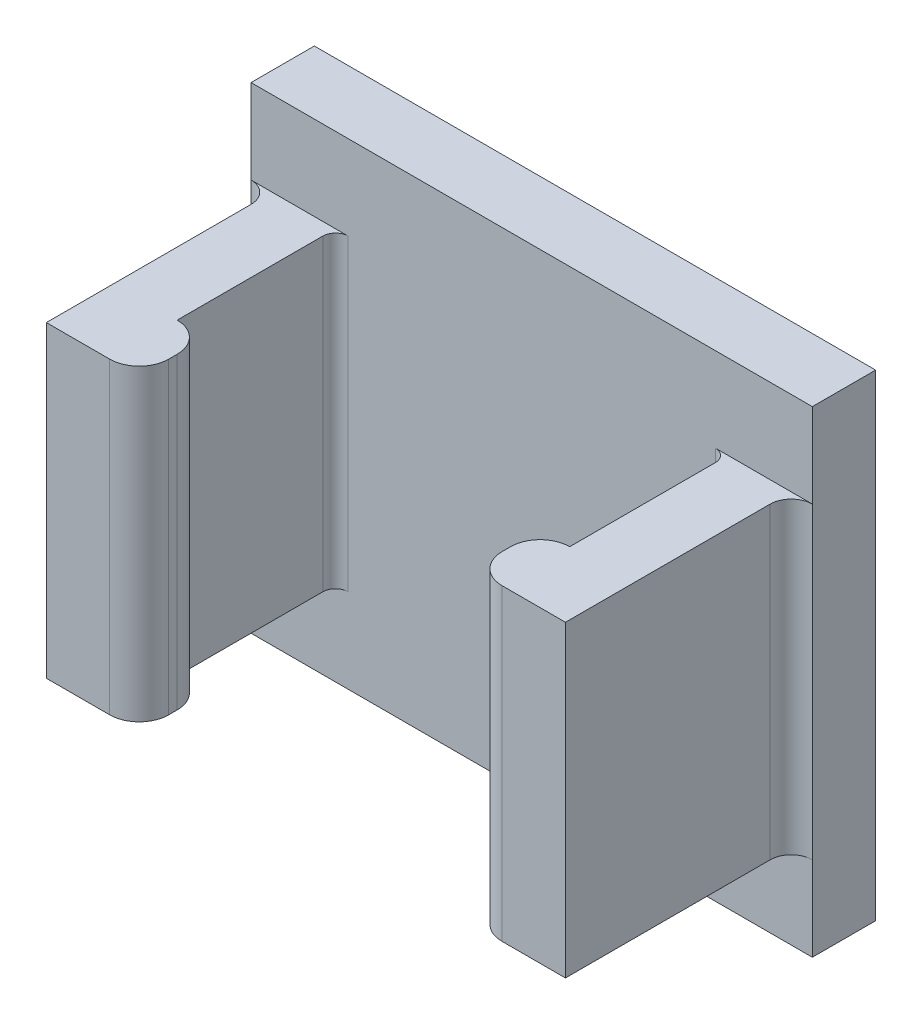
ISO-10303-21;
HEADER;
FILE_DESCRIPTION(('STEP AP214'),'2;1');
FILE_NAME('part.step','',(''),(''),'','','');
FILE_SCHEMA(('AUTOMOTIVE_DESIGN { 1 0 10303 214 1 1 1 1 }'));
ENDSEC;
DATA;
#1=APPLICATION_CONTEXT('core data for automotive mechanical design processes');
#2=APPLICATION_PROTOCOL_DEFINITION('international standard','automotive_design',2000,#1);
#3=PRODUCT_CONTEXT('',#1,'mechanical');
#4=PRODUCT('Part','Part','',(#3));
#5=PRODUCT_RELATED_PRODUCT_CATEGORY('part','',(#4));
#6=PRODUCT_DEFINITION_FORMATION('','',#4);
#7=PRODUCT_DEFINITION_CONTEXT('part definition',#1,'design');
#8=PRODUCT_DEFINITION('design','',#6,#7);
#9=PRODUCT_DEFINITION_SHAPE('','',#8);
#10=(LENGTH_UNIT() NAMED_UNIT(*) SI_UNIT(.MILLI.,.METRE.));
#11=(NAMED_UNIT(*) PLANE_ANGLE_UNIT() SI_UNIT($,.RADIAN.));
#12=(NAMED_UNIT(*) SI_UNIT($,.STERADIAN.) SOLID_ANGLE_UNIT());
#13=UNCERTAINTY_MEASURE_WITH_UNIT(LENGTH_MEASURE(1.E-05),#10,'distance_accuracy_value','');
#14=(GEOMETRIC_REPRESENTATION_CONTEXT(3) GLOBAL_UNCERTAINTY_ASSIGNED_CONTEXT((#13)) GLOBAL_UNIT_ASSIGNED_CONTEXT((#10,
#11,#12)) REPRESENTATION_CONTEXT('',''));
#15=CARTESIAN_POINT('',(0.,0.,0.));
#16=DIRECTION('',(0.,0.,1.));
#17=DIRECTION('',(1.,0.,0.));
#18=AXIS2_PLACEMENT_3D('',#15,#16,#17);
#19=CARTESIAN_POINT('',(-6.15,-5.65,2.5));
#20=DIRECTION('',(1.,0.,0.));
#21=DIRECTION('',(0.,0.,-1.));
#22=AXIS2_PLACEMENT_3D('',#19,#20,#21);
#23=PLANE('',#22);
#24=DIRECTION('',(0.,0.,1.));
#25=VECTOR('',#24,1.);
#26=CARTESIAN_POINT('',(-6.15,3.65,6.85));
#27=LINE('',#26,#25);
#28=CARTESIAN_POINT('',(-6.15,3.65,2.));
#29=VERTEX_POINT('',#28);
#30=CARTESIAN_POINT('',(-6.15,3.65,6.85));
#31=VERTEX_POINT('',#30);
#32=EDGE_CURVE('E279',#29,#31,#27,.T.);
#33=ORIENTED_EDGE('',*,*,#32,.F.);
#34=DIRECTION('',(0.,1.,0.));
#35=VECTOR('',#34,1.);
#36=CARTESIAN_POINT('',(-6.15,-3.65,2.));
#37=LINE('',#36,#35);
#38=CARTESIAN_POINT('',(-6.15,-3.65,2.));
#39=VERTEX_POINT('',#38);
#40=EDGE_CURVE('E361',#29,#39,#37,.F.);
#41=ORIENTED_EDGE('',*,*,#40,.T.);
#42=DIRECTION('',(0.,0.,-1.));
#43=VECTOR('',#42,1.);
#44=CARTESIAN_POINT('',(-6.15,-3.65,6.85));
#45=LINE('',#44,#43);
#46=CARTESIAN_POINT('',(-6.15,-3.65,6.85));
#47=VERTEX_POINT('',#46);
#48=EDGE_CURVE('E247',#47,#39,#45,.T.);
#49=ORIENTED_EDGE('',*,*,#48,.F.);
#50=DIRECTION('',(0.,-1.,0.));
#51=VECTOR('',#50,1.);
#52=CARTESIAN_POINT('',(-6.15,5.65,6.85));
#53=LINE('',#52,#51);
#54=EDGE_CURVE('E325',#31,#47,#53,.T.);
#55=ORIENTED_EDGE('',*,*,#54,.F.);
#56=EDGE_LOOP('',(#33,#41,#49,#55));
#57=FACE_BOUND('',#56,.T.);
#58=ADVANCED_FACE('F41',(#57),#23,.F.);
#59=CARTESIAN_POINT('',(6.15,-5.65,2.5));
#60=DIRECTION('',(-1.,0.,0.));
#61=DIRECTION('',(0.,0.,1.));
#62=AXIS2_PLACEMENT_3D('',#59,#60,#61);
#63=PLANE('',#62);
#64=DIRECTION('',(0.,0.,1.));
#65=VECTOR('',#64,1.);
#66=CARTESIAN_POINT('',(6.15,-3.65,6.85));
#67=LINE('',#66,#65);
#68=CARTESIAN_POINT('',(6.15,-3.65,2.));
#69=VERTEX_POINT('',#68);
#70=CARTESIAN_POINT('',(6.15,-3.65,6.85));
#71=VERTEX_POINT('',#70);
#72=EDGE_CURVE('E255',#69,#71,#67,.T.);
#73=ORIENTED_EDGE('',*,*,#72,.F.);
#74=DIRECTION('',(0.,-1.,0.));
#75=VECTOR('',#74,1.);
#76=CARTESIAN_POINT('',(6.15,3.65,2.));
#77=LINE('',#76,#75);
#78=CARTESIAN_POINT('',(6.15,3.65,2.));
#79=VERTEX_POINT('',#78);
#80=EDGE_CURVE('E358',#69,#79,#77,.F.);
#81=ORIENTED_EDGE('',*,*,#80,.T.);
#82=DIRECTION('',(0.,0.,-1.));
#83=VECTOR('',#82,1.);
#84=CARTESIAN_POINT('',(6.15,3.65,6.85));
#85=LINE('',#84,#83);
#86=CARTESIAN_POINT('',(6.15,3.65,6.85));
#87=VERTEX_POINT('',#86);
#88=EDGE_CURVE('E287',#87,#79,#85,.T.);
#89=ORIENTED_EDGE('',*,*,#88,.F.);
#90=DIRECTION('',(0.,1.,0.));
#91=VECTOR('',#90,1.);
#92=CARTESIAN_POINT('',(6.15,5.65,6.85));
#93=LINE('',#92,#91);
#94=EDGE_CURVE('E216',#71,#87,#93,.T.);
#95=ORIENTED_EDGE('',*,*,#94,.F.);
#96=EDGE_LOOP('',(#73,#81,#89,#95));
#97=FACE_BOUND('',#96,.T.);
#98=ADVANCED_FACE('F506',(#97),#63,.F.);
#99=CARTESIAN_POINT('',(4.65,5.65,6.85));
#100=DIRECTION('',(1.,0.,0.));
#101=DIRECTION('',(0.,1.,0.));
#102=AXIS2_PLACEMENT_3D('',#99,#100,#101);
#103=PLANE('',#102);
#104=DIRECTION('',(0.,0.,-1.));
#105=VECTOR('',#104,1.);
#106=CARTESIAN_POINT('',(4.65,-3.65,6.85));
#107=LINE('',#106,#105);
#108=CARTESIAN_POINT('',(4.65,-3.65,5.25));
#109=VERTEX_POINT('',#108);
#110=CARTESIAN_POINT('',(4.65,-3.65,1.8));
#111=VERTEX_POINT('',#110);
#112=EDGE_CURVE('E272',#109,#111,#107,.T.);
#113=ORIENTED_EDGE('',*,*,#112,.F.);
#114=DIRECTION('',(0.,-1.,0.));
#115=VECTOR('',#114,1.);
#116=CARTESIAN_POINT('',(4.65,-5.65,5.25));
#117=LINE('',#116,#115);
#118=CARTESIAN_POINT('',(4.65,3.65,5.25));
#119=VERTEX_POINT('',#118);
#120=EDGE_CURVE('E315',#119,#109,#117,.T.);
#121=ORIENTED_EDGE('',*,*,#120,.F.);
#122=DIRECTION('',(0.,0.,-1.));
#123=VECTOR('',#122,1.);
#124=CARTESIAN_POINT('',(4.65,3.65,6.85));
#125=LINE('',#124,#123);
#126=CARTESIAN_POINT('',(4.65,3.65,1.8));
#127=VERTEX_POINT('',#126);
#128=EDGE_CURVE('E308',#119,#127,#125,.T.);
#129=ORIENTED_EDGE('',*,*,#128,.T.);
#130=DIRECTION('',(0.,1.,0.));
#131=VECTOR('',#130,1.);
#132=CARTESIAN_POINT('',(4.65,-5.65,1.8));
#133=LINE('',#132,#131);
#134=EDGE_CURVE('E344',#127,#111,#133,.F.);
#135=ORIENTED_EDGE('',*,*,#134,.T.);
#136=EDGE_LOOP('',(#113,#121,#129,#135));
#137=FACE_BOUND('',#136,.T.);
#138=ADVANCED_FACE('F433',(#137),#103,.F.);
#139=CARTESIAN_POINT('',(-4.65,5.65,6.85));
#140=DIRECTION('',(-1.,0.,0.));
#141=DIRECTION('',(0.,-1.,0.));
#142=AXIS2_PLACEMENT_3D('',#139,#140,#141);
#143=PLANE('',#142);
#144=DIRECTION('',(0.,0.,1.));
#145=VECTOR('',#144,1.);
#146=CARTESIAN_POINT('',(-4.65,-3.65,6.85));
#147=LINE('',#146,#145);
#148=CARTESIAN_POINT('',(-4.65,-3.65,1.8));
#149=VERTEX_POINT('',#148);
#150=CARTESIAN_POINT('',(-4.65,-3.65,5.25));
#151=VERTEX_POINT('',#150);
#152=EDGE_CURVE('E262',#149,#151,#147,.T.);
#153=ORIENTED_EDGE('',*,*,#152,.F.);
#154=DIRECTION('',(0.,-1.,0.));
#155=VECTOR('',#154,1.);
#156=CARTESIAN_POINT('',(-4.65,5.65,1.8));
#157=LINE('',#156,#155);
#158=CARTESIAN_POINT('',(-4.65,3.65,1.8));
#159=VERTEX_POINT('',#158);
#160=EDGE_CURVE('E348',#149,#159,#157,.F.);
#161=ORIENTED_EDGE('',*,*,#160,.T.);
#162=DIRECTION('',(0.,0.,1.));
#163=VECTOR('',#162,1.);
#164=CARTESIAN_POINT('',(-4.65,3.65,6.85));
#165=LINE('',#164,#163);
#166=CARTESIAN_POINT('',(-4.65,3.65,5.25));
#167=VERTEX_POINT('',#166);
#168=EDGE_CURVE('E296',#159,#167,#165,.T.);
#169=ORIENTED_EDGE('',*,*,#168,.T.);
#170=DIRECTION('',(0.,1.,0.));
#171=VECTOR('',#170,1.);
#172=CARTESIAN_POINT('',(-4.65,5.65,5.25));
#173=LINE('',#172,#171);
#174=EDGE_CURVE('E217',#151,#167,#173,.T.);
#175=ORIENTED_EDGE('',*,*,#174,.F.);
#176=EDGE_LOOP('',(#153,#161,#169,#175));
#177=FACE_BOUND('',#176,.T.);
#178=ADVANCED_FACE('F491',(#177),#143,.F.);
#179=CARTESIAN_POINT('',(0.,0.,6.85));
#180=DIRECTION('',(0.,0.,1.));
#181=DIRECTION('',(1.,0.,0.));
#182=AXIS2_PLACEMENT_3D('',#179,#180,#181);
#183=PLANE('',#182);
#184=DIRECTION('',(-1.,0.,0.));
#185=VECTOR('',#184,1.);
#186=CARTESIAN_POINT('',(-6.15,-3.65,6.85));
#187=LINE('',#186,#185);
#188=CARTESIAN_POINT('',(-4.65,-3.65,6.85));
#189=VERTEX_POINT('',#188);
#190=EDGE_CURVE('E258',#189,#47,#187,.T.);
#191=ORIENTED_EDGE('',*,*,#190,.F.);
#192=DIRECTION('',(0.,-1.,0.));
#193=VECTOR('',#192,1.);
#194=CARTESIAN_POINT('',(-4.65,0.,6.85));
#195=LINE('',#194,#193);
#196=CARTESIAN_POINT('',(-4.65,3.65,6.85));
#197=VERTEX_POINT('',#196);
#198=EDGE_CURVE('E392',#189,#197,#195,.F.);
#199=ORIENTED_EDGE('',*,*,#198,.T.);
#200=DIRECTION('',(1.,0.,0.));
#201=VECTOR('',#200,1.);
#202=CARTESIAN_POINT('',(-6.15,3.65,6.85));
#203=LINE('',#202,#201);
#204=EDGE_CURVE('E283',#31,#197,#203,.T.);
#205=ORIENTED_EDGE('',*,*,#204,.F.);
#206=ORIENTED_EDGE('',*,*,#54,.T.);
#207=EDGE_LOOP('',(#191,#199,#205,#206));
#208=FACE_BOUND('',#207,.T.);
#209=ADVANCED_FACE('F471',(#208),#183,.T.);
#210=CARTESIAN_POINT('',(0.,0.,6.85));
#211=DIRECTION('',(0.,0.,-1.));
#212=DIRECTION('',(-1.,0.,0.));
#213=AXIS2_PLACEMENT_3D('',#210,#211,#212);
#214=PLANE('',#213);
#215=CARTESIAN_POINT('',(4.65,3.65,6.85));
#216=VERTEX_POINT('',#215);
#217=EDGE_CURVE('E282',#216,#87,#203,.T.);
#218=ORIENTED_EDGE('',*,*,#217,.F.);
#219=DIRECTION('',(0.,1.,0.));
#220=VECTOR('',#219,1.);
#221=CARTESIAN_POINT('',(4.65,-3.65,6.85));
#222=LINE('',#221,#220);
#223=CARTESIAN_POINT('',(4.65,-3.65,6.85));
#224=VERTEX_POINT('',#223);
#225=EDGE_CURVE('E11',#216,#224,#222,.F.);
#226=ORIENTED_EDGE('',*,*,#225,.T.);
#227=EDGE_CURVE('E259',#71,#224,#187,.T.);
#228=ORIENTED_EDGE('',*,*,#227,.F.);
#229=ORIENTED_EDGE('',*,*,#94,.T.);
#230=EDGE_LOOP('',(#218,#226,#228,#229));
#231=FACE_BOUND('',#230,.T.);
#232=ADVANCED_FACE('F503',(#231),#214,.F.);
#233=CARTESIAN_POINT('',(-3.95,0.,0.));
#234=DIRECTION('',(1.,0.,0.));
#235=DIRECTION('',(0.,1.,0.));
#236=AXIS2_PLACEMENT_3D('',#233,#234,#235);
#237=PLANE('',#236);
#238=DIRECTION('',(0.,0.,-1.));
#239=VECTOR('',#238,1.);
#240=CARTESIAN_POINT('',(-3.95,3.65,0.));
#241=LINE('',#240,#239);
#242=CARTESIAN_POINT('',(-3.95,3.65,6.15));
#243=VERTEX_POINT('',#242);
#244=CARTESIAN_POINT('',(-3.95,3.65,5.95));
#245=VERTEX_POINT('',#244);
#246=EDGE_CURVE('E300',#243,#245,#241,.T.);
#247=ORIENTED_EDGE('',*,*,#246,.F.);
#248=DIRECTION('',(0.,-1.,0.));
#249=VECTOR('',#248,1.);
#250=CARTESIAN_POINT('',(-3.95,0.,6.15));
#251=LINE('',#250,#249);
#252=CARTESIAN_POINT('',(-3.95,-3.65,6.15));
#253=VERTEX_POINT('',#252);
#254=EDGE_CURVE('E382',#243,#253,#251,.T.);
#255=ORIENTED_EDGE('',*,*,#254,.T.);
#256=DIRECTION('',(0.,0.,-1.));
#257=VECTOR('',#256,1.);
#258=CARTESIAN_POINT('',(-3.95,-3.65,0.));
#259=LINE('',#258,#257);
#260=CARTESIAN_POINT('',(-3.95,-3.65,5.95));
#261=VERTEX_POINT('',#260);
#262=EDGE_CURVE('E265',#253,#261,#259,.T.);
#263=ORIENTED_EDGE('',*,*,#262,.T.);
#264=DIRECTION('',(0.,1.,0.));
#265=VECTOR('',#264,1.);
#266=CARTESIAN_POINT('',(-3.95,3.65,5.95));
#267=LINE('',#266,#265);
#268=EDGE_CURVE('E378',#261,#245,#267,.T.);
#269=ORIENTED_EDGE('',*,*,#268,.T.);
#270=EDGE_LOOP('',(#247,#255,#263,#269));
#271=FACE_BOUND('',#270,.T.);
#272=ADVANCED_FACE('F480',(#271),#237,.T.);
#273=CARTESIAN_POINT('',(3.95,0.,0.));
#274=DIRECTION('',(-1.,0.,0.));
#275=DIRECTION('',(0.,-1.,0.));
#276=AXIS2_PLACEMENT_3D('',#273,#274,#275);
#277=PLANE('',#276);
#278=DIRECTION('',(0.,0.,1.));
#279=VECTOR('',#278,1.);
#280=CARTESIAN_POINT('',(3.95,3.65,0.));
#281=LINE('',#280,#279);
#282=CARTESIAN_POINT('',(3.95,3.65,5.95));
#283=VERTEX_POINT('',#282);
#284=CARTESIAN_POINT('',(3.95,3.65,6.15));
#285=VERTEX_POINT('',#284);
#286=EDGE_CURVE('E312',#283,#285,#281,.T.);
#287=ORIENTED_EDGE('',*,*,#286,.F.);
#288=DIRECTION('',(0.,-1.,0.));
#289=VECTOR('',#288,1.);
#290=CARTESIAN_POINT('',(3.95,-3.65,5.95));
#291=LINE('',#290,#289);
#292=CARTESIAN_POINT('',(3.95,-3.65,5.95));
#293=VERTEX_POINT('',#292);
#294=EDGE_CURVE('E405',#283,#293,#291,.T.);
#295=ORIENTED_EDGE('',*,*,#294,.T.);
#296=DIRECTION('',(0.,0.,1.));
#297=VECTOR('',#296,1.);
#298=CARTESIAN_POINT('',(3.95,-3.65,0.));
#299=LINE('',#298,#297);
#300=CARTESIAN_POINT('',(3.95,-3.65,6.15));
#301=VERTEX_POINT('',#300);
#302=EDGE_CURVE('E275',#293,#301,#299,.T.);
#303=ORIENTED_EDGE('',*,*,#302,.T.);
#304=DIRECTION('',(0.,1.,0.));
#305=VECTOR('',#304,1.);
#306=CARTESIAN_POINT('',(3.95,3.65,6.15));
#307=LINE('',#306,#305);
#308=EDGE_CURVE('E401',#301,#285,#307,.T.);
#309=ORIENTED_EDGE('',*,*,#308,.T.);
#310=EDGE_LOOP('',(#287,#295,#303,#309));
#311=FACE_BOUND('',#310,.T.);
#312=ADVANCED_FACE('F424',(#311),#277,.T.);
#313=CARTESIAN_POINT('',(4.35,0.,1.8));
#314=DIRECTION('',(0.,-1.,0.));
#315=DIRECTION('',(1.,0.,0.));
#316=AXIS2_PLACEMENT_3D('',#313,#314,#315);
#317=CYLINDRICAL_SURFACE('',#316,0.3);
#318=CARTESIAN_POINT('',(4.35,-3.65,1.8));
#319=DIRECTION('',(0.,-1.,0.));
#320=DIRECTION('',(0.,0.,-1.));
#321=AXIS2_PLACEMENT_3D('',#318,#319,#320);
#322=CIRCLE('',#321,0.3);
#323=CARTESIAN_POINT('',(4.35,-3.65,1.5));
#324=VERTEX_POINT('',#323);
#325=EDGE_CURVE('E269',#111,#324,#322,.F.);
#326=ORIENTED_EDGE('',*,*,#325,.F.);
#327=ORIENTED_EDGE('',*,*,#134,.F.);
#328=CARTESIAN_POINT('',(4.35,3.65,1.8));
#329=DIRECTION('',(0.,-1.,0.));
#330=DIRECTION('',(0.,0.,-1.));
#331=AXIS2_PLACEMENT_3D('',#328,#329,#330);
#332=CIRCLE('',#331,0.3);
#333=CARTESIAN_POINT('',(4.35,3.65,1.5));
#334=VERTEX_POINT('',#333);
#335=EDGE_CURVE('E304',#127,#334,#332,.F.);
#336=ORIENTED_EDGE('',*,*,#335,.T.);
#337=DIRECTION('',(0.,1.,0.));
#338=VECTOR('',#337,1.);
#339=CARTESIAN_POINT('',(4.35,5.65,1.5));
#340=LINE('',#339,#338);
#341=EDGE_CURVE('E341',#324,#334,#340,.T.);
#342=ORIENTED_EDGE('',*,*,#341,.F.);
#343=EDGE_LOOP('',(#326,#327,#336,#342));
#344=FACE_BOUND('',#343,.T.);
#345=ADVANCED_FACE('F436',(#344),#317,.F.);
#346=CARTESIAN_POINT('',(-4.35,0.,1.8));
#347=DIRECTION('',(0.,1.,0.));
#348=DIRECTION('',(-1.,0.,0.));
#349=AXIS2_PLACEMENT_3D('',#346,#347,#348);
#350=CYLINDRICAL_SURFACE('',#349,0.3);
#351=CARTESIAN_POINT('',(-4.35,-3.65,1.8));
#352=DIRECTION('',(0.,-1.,0.));
#353=DIRECTION('',(0.,0.,-1.));
#354=AXIS2_PLACEMENT_3D('',#351,#352,#353);
#355=CIRCLE('',#354,0.3);
#356=CARTESIAN_POINT('',(-4.35,-3.65,1.5));
#357=VERTEX_POINT('',#356);
#358=EDGE_CURVE('E355',#357,#149,#355,.F.);
#359=ORIENTED_EDGE('',*,*,#358,.F.);
#360=DIRECTION('',(0.,-1.,0.));
#361=VECTOR('',#360,1.);
#362=CARTESIAN_POINT('',(-4.35,-5.65,1.5));
#363=LINE('',#362,#361);
#364=CARTESIAN_POINT('',(-4.35,3.65,1.5));
#365=VERTEX_POINT('',#364);
#366=EDGE_CURVE('E337',#365,#357,#363,.T.);
#367=ORIENTED_EDGE('',*,*,#366,.F.);
#368=CARTESIAN_POINT('',(-4.35,3.65,1.8));
#369=DIRECTION('',(0.,-1.,0.));
#370=DIRECTION('',(0.,0.,-1.));
#371=AXIS2_PLACEMENT_3D('',#368,#369,#370);
#372=CIRCLE('',#371,0.3);
#373=EDGE_CURVE('E351',#365,#159,#372,.F.);
#374=ORIENTED_EDGE('',*,*,#373,.T.);
#375=ORIENTED_EDGE('',*,*,#160,.F.);
#376=EDGE_LOOP('',(#359,#367,#374,#375));
#377=FACE_BOUND('',#376,.T.);
#378=ADVANCED_FACE('F495',(#377),#350,.F.);
#379=CARTESIAN_POINT('',(-6.15,5.65,2.5));
#380=DIRECTION('',(0.,-1.,0.));
#381=DIRECTION('',(0.,0.,-1.));
#382=AXIS2_PLACEMENT_3D('',#379,#380,#381);
#383=PLANE('',#382);
#384=DIRECTION('',(-1.,0.,0.));
#385=VECTOR('',#384,1.);
#386=CARTESIAN_POINT('',(-6.15,5.65,0.));
#387=LINE('',#386,#385);
#388=CARTESIAN_POINT('',(6.65,5.65,0.));
#389=VERTEX_POINT('',#388);
#390=CARTESIAN_POINT('',(-6.65,5.65,0.));
#391=VERTEX_POINT('',#390);
#392=EDGE_CURVE('E220',#389,#391,#387,.T.);
#393=ORIENTED_EDGE('',*,*,#392,.T.);
#394=DIRECTION('',(0.,0.,-1.));
#395=VECTOR('',#394,1.);
#396=CARTESIAN_POINT('',(-6.65,5.65,1.5));
#397=LINE('',#396,#395);
#398=CARTESIAN_POINT('',(-6.65,5.65,1.5));
#399=VERTEX_POINT('',#398);
#400=EDGE_CURVE('E197',#399,#391,#397,.T.);
#401=ORIENTED_EDGE('',*,*,#400,.F.);
#402=DIRECTION('',(1.,0.,0.));
#403=VECTOR('',#402,1.);
#404=CARTESIAN_POINT('',(-6.15,5.65,1.5));
#405=LINE('',#404,#403);
#406=CARTESIAN_POINT('',(6.65,5.65,1.5));
#407=VERTEX_POINT('',#406);
#408=EDGE_CURVE('E207',#399,#407,#405,.T.);
#409=ORIENTED_EDGE('',*,*,#408,.T.);
#410=DIRECTION('',(0.,0.,1.));
#411=VECTOR('',#410,1.);
#412=CARTESIAN_POINT('',(6.65,5.65,1.5));
#413=LINE('',#412,#411);
#414=EDGE_CURVE('E244',#389,#407,#413,.T.);
#415=ORIENTED_EDGE('',*,*,#414,.F.);
#416=EDGE_LOOP('',(#393,#401,#409,#415));
#417=FACE_BOUND('',#416,.T.);
#418=ADVANCED_FACE('F219',(#417),#383,.F.);
#419=CARTESIAN_POINT('',(-6.15,-5.65,2.5));
#420=DIRECTION('',(0.,1.,0.));
#421=DIRECTION('',(0.,0.,1.));
#422=AXIS2_PLACEMENT_3D('',#419,#420,#421);
#423=PLANE('',#422);
#424=DIRECTION('',(1.,0.,0.));
#425=VECTOR('',#424,1.);
#426=CARTESIAN_POINT('',(-6.15,-5.65,0.));
#427=LINE('',#426,#425);
#428=CARTESIAN_POINT('',(-6.65,-5.65,0.));
#429=VERTEX_POINT('',#428);
#430=CARTESIAN_POINT('',(6.65,-5.65,0.));
#431=VERTEX_POINT('',#430);
#432=EDGE_CURVE('E331',#429,#431,#427,.T.);
#433=ORIENTED_EDGE('',*,*,#432,.T.);
#434=DIRECTION('',(0.,0.,-1.));
#435=VECTOR('',#434,1.);
#436=CARTESIAN_POINT('',(6.65,-5.65,1.5));
#437=LINE('',#436,#435);
#438=CARTESIAN_POINT('',(6.65,-5.65,1.5));
#439=VERTEX_POINT('',#438);
#440=EDGE_CURVE('E235',#439,#431,#437,.T.);
#441=ORIENTED_EDGE('',*,*,#440,.F.);
#442=DIRECTION('',(-1.,0.,0.));
#443=VECTOR('',#442,1.);
#444=CARTESIAN_POINT('',(-6.15,-5.65,1.5));
#445=LINE('',#444,#443);
#446=CARTESIAN_POINT('',(-6.65,-5.65,1.5));
#447=VERTEX_POINT('',#446);
#448=EDGE_CURVE('E334',#439,#447,#445,.T.);
#449=ORIENTED_EDGE('',*,*,#448,.T.);
#450=DIRECTION('',(0.,0.,1.));
#451=VECTOR('',#450,1.);
#452=CARTESIAN_POINT('',(-6.65,-5.65,1.5));
#453=LINE('',#452,#451);
#454=EDGE_CURVE('E226',#429,#447,#453,.T.);
#455=ORIENTED_EDGE('',*,*,#454,.F.);
#456=EDGE_LOOP('',(#433,#441,#449,#455));
#457=FACE_BOUND('',#456,.T.);
#458=ADVANCED_FACE('F453',(#457),#423,.F.);
#459=CARTESIAN_POINT('',(0.,0.,0.));
#460=DIRECTION('',(0.,0.,-1.));
#461=DIRECTION('',(-1.,0.,0.));
#462=AXIS2_PLACEMENT_3D('',#459,#460,#461);
#463=PLANE('',#462);
#464=ORIENTED_EDGE('',*,*,#392,.F.);
#465=DIRECTION('',(0.,1.,0.));
#466=VECTOR('',#465,1.);
#467=CARTESIAN_POINT('',(6.65,5.65,0.));
#468=LINE('',#467,#466);
#469=EDGE_CURVE('E240',#431,#389,#468,.T.);
#470=ORIENTED_EDGE('',*,*,#469,.F.);
#471=ORIENTED_EDGE('',*,*,#432,.F.);
#472=DIRECTION('',(0.,-1.,0.));
#473=VECTOR('',#472,1.);
#474=CARTESIAN_POINT('',(-6.65,5.65,0.));
#475=LINE('',#474,#473);
#476=EDGE_CURVE('E222',#391,#429,#475,.T.);
#477=ORIENTED_EDGE('',*,*,#476,.F.);
#478=EDGE_LOOP('',(#464,#470,#471,#477));
#479=FACE_BOUND('',#478,.T.);
#480=ADVANCED_FACE('F455',(#479),#463,.T.);
#481=CARTESIAN_POINT('',(0.,0.,1.5));
#482=DIRECTION('',(0.,0.,-1.));
#483=DIRECTION('',(-1.,0.,0.));
#484=AXIS2_PLACEMENT_3D('',#481,#482,#483);
#485=PLANE('',#484);
#486=DIRECTION('',(0.,-1.,0.));
#487=VECTOR('',#486,1.);
#488=CARTESIAN_POINT('',(6.65,5.65,1.5));
#489=LINE('',#488,#487);
#490=CARTESIAN_POINT('',(6.65,-3.65,1.5));
#491=VERTEX_POINT('',#490);
#492=EDGE_CURVE('E232',#491,#439,#489,.T.);
#493=ORIENTED_EDGE('',*,*,#492,.F.);
#494=DIRECTION('',(1.,0.,0.));
#495=VECTOR('',#494,1.);
#496=CARTESIAN_POINT('',(-6.15,-3.65,1.5));
#497=LINE('',#496,#495);
#498=EDGE_CURVE('E251',#324,#491,#497,.T.);
#499=ORIENTED_EDGE('',*,*,#498,.F.);
#500=ORIENTED_EDGE('',*,*,#341,.T.);
#501=DIRECTION('',(-1.,0.,0.));
#502=VECTOR('',#501,1.);
#503=CARTESIAN_POINT('',(-6.15,3.65,1.5));
#504=LINE('',#503,#502);
#505=CARTESIAN_POINT('',(6.65,3.65,1.5));
#506=VERTEX_POINT('',#505);
#507=EDGE_CURVE('E292',#506,#334,#504,.T.);
#508=ORIENTED_EDGE('',*,*,#507,.F.);
#509=EDGE_CURVE('E211',#407,#506,#489,.T.);
#510=ORIENTED_EDGE('',*,*,#509,.F.);
#511=ORIENTED_EDGE('',*,*,#408,.F.);
#512=DIRECTION('',(0.,1.,0.));
#513=VECTOR('',#512,1.);
#514=CARTESIAN_POINT('',(-6.65,5.65,1.5));
#515=LINE('',#514,#513);
#516=CARTESIAN_POINT('',(-6.65,3.65,1.5));
#517=VERTEX_POINT('',#516);
#518=EDGE_CURVE('E191',#517,#399,#515,.T.);
#519=ORIENTED_EDGE('',*,*,#518,.F.);
#520=EDGE_CURVE('E291',#365,#517,#504,.T.);
#521=ORIENTED_EDGE('',*,*,#520,.F.);
#522=ORIENTED_EDGE('',*,*,#366,.T.);
#523=CARTESIAN_POINT('',(-6.65,-3.65,1.5));
#524=VERTEX_POINT('',#523);
#525=EDGE_CURVE('E252',#524,#357,#497,.T.);
#526=ORIENTED_EDGE('',*,*,#525,.F.);
#527=EDGE_CURVE('E205',#447,#524,#515,.T.);
#528=ORIENTED_EDGE('',*,*,#527,.F.);
#529=ORIENTED_EDGE('',*,*,#448,.F.);
#530=EDGE_LOOP('',(#493,#499,#500,#508,#510,#511,#519,#521,#522,#526,#528,#529));
#531=FACE_BOUND('',#530,.T.);
#532=ADVANCED_FACE('F209',(#531),#485,.F.);
#533=CARTESIAN_POINT('',(0.,3.65,0.));
#534=DIRECTION('',(0.,-1.,0.));
#535=DIRECTION('',(0.,0.,-1.));
#536=AXIS2_PLACEMENT_3D('',#533,#534,#535);
#537=PLANE('',#536);
#538=ORIENTED_EDGE('',*,*,#204,.T.);
#539=CARTESIAN_POINT('',(-4.65,3.65,6.15));
#540=DIRECTION('',(0.,-1.,0.));
#541=DIRECTION('',(0.,0.,-1.));
#542=AXIS2_PLACEMENT_3D('',#539,#540,#541);
#543=CIRCLE('',#542,0.7);
#544=EDGE_CURVE('E398',#197,#243,#543,.F.);
#545=ORIENTED_EDGE('',*,*,#544,.T.);
#546=ORIENTED_EDGE('',*,*,#246,.T.);
#547=CARTESIAN_POINT('',(-4.65,3.65,5.95));
#548=DIRECTION('',(0.,-1.,0.));
#549=DIRECTION('',(0.,0.,-1.));
#550=AXIS2_PLACEMENT_3D('',#547,#548,#549);
#551=CIRCLE('',#550,0.7);
#552=EDGE_CURVE('E395',#245,#167,#551,.F.);
#553=ORIENTED_EDGE('',*,*,#552,.T.);
#554=ORIENTED_EDGE('',*,*,#168,.F.);
#555=ORIENTED_EDGE('',*,*,#373,.F.);
#556=ORIENTED_EDGE('',*,*,#520,.T.);
#557=CARTESIAN_POINT('',(-6.65,3.65,2.));
#558=DIRECTION('',(0.,-1.,0.));
#559=DIRECTION('',(0.,0.,-1.));
#560=AXIS2_PLACEMENT_3D('',#557,#558,#559);
#561=CIRCLE('',#560,0.5);
#562=EDGE_CURVE('E371',#517,#29,#561,.T.);
#563=ORIENTED_EDGE('',*,*,#562,.T.);
#564=ORIENTED_EDGE('',*,*,#32,.T.);
#565=EDGE_LOOP('',(#538,#545,#546,#553,#554,#555,#556,#563,#564));
#566=FACE_BOUND('',#565,.T.);
#567=ADVANCED_FACE('F464',(#566),#537,.F.);
#568=ORIENTED_EDGE('',*,*,#128,.F.);
#569=CARTESIAN_POINT('',(4.65,3.65,5.95));
#570=DIRECTION('',(0.,-1.,0.));
#571=DIRECTION('',(0.,0.,-1.));
#572=AXIS2_PLACEMENT_3D('',#569,#570,#571);
#573=CIRCLE('',#572,0.7);
#574=EDGE_CURVE('E50',#119,#283,#573,.F.);
#575=ORIENTED_EDGE('',*,*,#574,.T.);
#576=ORIENTED_EDGE('',*,*,#286,.T.);
#577=CARTESIAN_POINT('',(4.65,3.65,6.15));
#578=DIRECTION('',(0.,-1.,0.));
#579=DIRECTION('',(0.,0.,-1.));
#580=AXIS2_PLACEMENT_3D('',#577,#578,#579);
#581=CIRCLE('',#580,0.7);
#582=EDGE_CURVE('E57',#285,#216,#581,.F.);
#583=ORIENTED_EDGE('',*,*,#582,.T.);
#584=ORIENTED_EDGE('',*,*,#217,.T.);
#585=ORIENTED_EDGE('',*,*,#88,.T.);
#586=CARTESIAN_POINT('',(6.65,3.65,2.));
#587=DIRECTION('',(0.,-1.,0.));
#588=DIRECTION('',(0.,0.,-1.));
#589=AXIS2_PLACEMENT_3D('',#586,#587,#588);
#590=CIRCLE('',#589,0.5);
#591=EDGE_CURVE('E367',#79,#506,#590,.T.);
#592=ORIENTED_EDGE('',*,*,#591,.T.);
#593=ORIENTED_EDGE('',*,*,#507,.T.);
#594=ORIENTED_EDGE('',*,*,#335,.F.);
#595=EDGE_LOOP('',(#568,#575,#576,#583,#584,#585,#592,#593,#594));
#596=FACE_BOUND('',#595,.T.);
#597=ADVANCED_FACE('F419',(#596),#537,.F.);
#598=CARTESIAN_POINT('',(0.,-3.65,0.));
#599=DIRECTION('',(0.,-1.,0.));
#600=DIRECTION('',(0.,0.,-1.));
#601=AXIS2_PLACEMENT_3D('',#598,#599,#600);
#602=PLANE('',#601);
#603=ORIENTED_EDGE('',*,*,#262,.F.);
#604=CARTESIAN_POINT('',(-4.65,-3.65,6.15));
#605=DIRECTION('',(0.,-1.,0.));
#606=DIRECTION('',(0.,0.,-1.));
#607=AXIS2_PLACEMENT_3D('',#604,#605,#606);
#608=CIRCLE('',#607,0.7);
#609=EDGE_CURVE('E389',#253,#189,#608,.T.);
#610=ORIENTED_EDGE('',*,*,#609,.T.);
#611=ORIENTED_EDGE('',*,*,#190,.T.);
#612=ORIENTED_EDGE('',*,*,#48,.T.);
#613=CARTESIAN_POINT('',(-6.65,-3.65,2.));
#614=DIRECTION('',(0.,-1.,0.));
#615=DIRECTION('',(0.,0.,-1.));
#616=AXIS2_PLACEMENT_3D('',#613,#614,#615);
#617=CIRCLE('',#616,0.5);
#618=EDGE_CURVE('E374',#39,#524,#617,.F.);
#619=ORIENTED_EDGE('',*,*,#618,.T.);
#620=ORIENTED_EDGE('',*,*,#525,.T.);
#621=ORIENTED_EDGE('',*,*,#358,.T.);
#622=ORIENTED_EDGE('',*,*,#152,.T.);
#623=CARTESIAN_POINT('',(-4.65,-3.65,5.95));
#624=DIRECTION('',(0.,-1.,0.));
#625=DIRECTION('',(0.,0.,-1.));
#626=AXIS2_PLACEMENT_3D('',#623,#624,#625);
#627=CIRCLE('',#626,0.7);
#628=EDGE_CURVE('E386',#151,#261,#627,.T.);
#629=ORIENTED_EDGE('',*,*,#628,.T.);
#630=EDGE_LOOP('',(#603,#610,#611,#612,#619,#620,#621,#622,#629));
#631=FACE_BOUND('',#630,.T.);
#632=ADVANCED_FACE('F483',(#631),#602,.T.);
#633=ORIENTED_EDGE('',*,*,#302,.F.);
#634=CARTESIAN_POINT('',(4.65,-3.65,5.95));
#635=DIRECTION('',(0.,-1.,0.));
#636=DIRECTION('',(0.,0.,-1.));
#637=AXIS2_PLACEMENT_3D('',#634,#635,#636);
#638=CIRCLE('',#637,0.7);
#639=EDGE_CURVE('E412',#293,#109,#638,.T.);
#640=ORIENTED_EDGE('',*,*,#639,.T.);
#641=ORIENTED_EDGE('',*,*,#112,.T.);
#642=ORIENTED_EDGE('',*,*,#325,.T.);
#643=ORIENTED_EDGE('',*,*,#498,.T.);
#644=CARTESIAN_POINT('',(6.65,-3.65,2.));
#645=DIRECTION('',(0.,-1.,0.));
#646=DIRECTION('',(0.,0.,-1.));
#647=AXIS2_PLACEMENT_3D('',#644,#645,#646);
#648=CIRCLE('',#647,0.5);
#649=EDGE_CURVE('E364',#491,#69,#648,.F.);
#650=ORIENTED_EDGE('',*,*,#649,.T.);
#651=ORIENTED_EDGE('',*,*,#72,.T.);
#652=ORIENTED_EDGE('',*,*,#227,.T.);
#653=CARTESIAN_POINT('',(4.65,-3.65,6.15));
#654=DIRECTION('',(0.,-1.,0.));
#655=DIRECTION('',(0.,0.,-1.));
#656=AXIS2_PLACEMENT_3D('',#653,#654,#655);
#657=CIRCLE('',#656,0.7);
#658=EDGE_CURVE('E409',#224,#301,#657,.T.);
#659=ORIENTED_EDGE('',*,*,#658,.T.);
#660=EDGE_LOOP('',(#633,#640,#641,#642,#643,#650,#651,#652,#659));
#661=FACE_BOUND('',#660,.T.);
#662=ADVANCED_FACE('F430',(#661),#602,.T.);
#663=CARTESIAN_POINT('',(6.65,0.,0.));
#664=DIRECTION('',(1.,0.,0.));
#665=DIRECTION('',(0.,0.,-1.));
#666=AXIS2_PLACEMENT_3D('',#663,#664,#665);
#667=PLANE('',#666);
#668=ORIENTED_EDGE('',*,*,#509,.T.);
#669=EDGE_CURVE('E236',#506,#491,#489,.T.);
#670=ORIENTED_EDGE('',*,*,#669,.T.);
#671=ORIENTED_EDGE('',*,*,#492,.T.);
#672=ORIENTED_EDGE('',*,*,#440,.T.);
#673=ORIENTED_EDGE('',*,*,#469,.T.);
#674=ORIENTED_EDGE('',*,*,#414,.T.);
#675=EDGE_LOOP('',(#668,#670,#671,#672,#673,#674));
#676=FACE_BOUND('',#675,.T.);
#677=ADVANCED_FACE('F446',(#676),#667,.T.);
#678=CARTESIAN_POINT('',(-6.65,0.,0.));
#679=DIRECTION('',(1.,0.,0.));
#680=DIRECTION('',(0.,0.,-1.));
#681=AXIS2_PLACEMENT_3D('',#678,#679,#680);
#682=PLANE('',#681);
#683=ORIENTED_EDGE('',*,*,#527,.T.);
#684=EDGE_CURVE('E200',#524,#517,#515,.T.);
#685=ORIENTED_EDGE('',*,*,#684,.T.);
#686=ORIENTED_EDGE('',*,*,#518,.T.);
#687=ORIENTED_EDGE('',*,*,#400,.T.);
#688=ORIENTED_EDGE('',*,*,#476,.T.);
#689=ORIENTED_EDGE('',*,*,#454,.T.);
#690=EDGE_LOOP('',(#683,#685,#686,#687,#688,#689));
#691=FACE_BOUND('',#690,.T.);
#692=ADVANCED_FACE('F194',(#691),#682,.F.);
#693=CARTESIAN_POINT('',(6.65,0.,2.));
#694=DIRECTION('',(0.,1.,0.));
#695=DIRECTION('',(0.,0.,1.));
#696=AXIS2_PLACEMENT_3D('',#693,#694,#695);
#697=CYLINDRICAL_SURFACE('',#696,0.5);
#698=ORIENTED_EDGE('',*,*,#591,.F.);
#699=ORIENTED_EDGE('',*,*,#80,.F.);
#700=ORIENTED_EDGE('',*,*,#649,.F.);
#701=ORIENTED_EDGE('',*,*,#669,.F.);
#702=EDGE_LOOP('',(#698,#699,#700,#701));
#703=FACE_BOUND('',#702,.T.);
#704=ADVANCED_FACE('F509',(#703),#697,.F.);
#705=CARTESIAN_POINT('',(-6.65,0.,2.));
#706=DIRECTION('',(0.,-1.,0.));
#707=DIRECTION('',(0.,0.,-1.));
#708=AXIS2_PLACEMENT_3D('',#705,#706,#707);
#709=CYLINDRICAL_SURFACE('',#708,0.5);
#710=ORIENTED_EDGE('',*,*,#618,.F.);
#711=ORIENTED_EDGE('',*,*,#40,.F.);
#712=ORIENTED_EDGE('',*,*,#562,.F.);
#713=ORIENTED_EDGE('',*,*,#684,.F.);
#714=EDGE_LOOP('',(#710,#711,#712,#713));
#715=FACE_BOUND('',#714,.T.);
#716=ADVANCED_FACE('F459',(#715),#709,.F.);
#717=CARTESIAN_POINT('',(-4.65,0.,6.15));
#718=DIRECTION('',(0.,-1.,0.));
#719=DIRECTION('',(1.,0.,0.));
#720=AXIS2_PLACEMENT_3D('',#717,#718,#719);
#721=CYLINDRICAL_SURFACE('',#720,0.7);
#722=ORIENTED_EDGE('',*,*,#544,.F.);
#723=ORIENTED_EDGE('',*,*,#198,.F.);
#724=ORIENTED_EDGE('',*,*,#609,.F.);
#725=ORIENTED_EDGE('',*,*,#254,.F.);
#726=EDGE_LOOP('',(#722,#723,#724,#725));
#727=FACE_BOUND('',#726,.T.);
#728=ADVANCED_FACE('F477',(#727),#721,.T.);
#729=CARTESIAN_POINT('',(-4.65,0.,5.95));
#730=DIRECTION('',(0.,-1.,0.));
#731=DIRECTION('',(1.,0.,0.));
#732=AXIS2_PLACEMENT_3D('',#729,#730,#731);
#733=CYLINDRICAL_SURFACE('',#732,0.7);
#734=ORIENTED_EDGE('',*,*,#628,.F.);
#735=ORIENTED_EDGE('',*,*,#174,.T.);
#736=ORIENTED_EDGE('',*,*,#552,.F.);
#737=ORIENTED_EDGE('',*,*,#268,.F.);
#738=EDGE_LOOP('',(#734,#735,#736,#737));
#739=FACE_BOUND('',#738,.T.);
#740=ADVANCED_FACE('F488',(#739),#733,.T.);
#741=CARTESIAN_POINT('',(4.65,0.,5.95));
#742=DIRECTION('',(0.,1.,0.));
#743=DIRECTION('',(-1.,0.,0.));
#744=AXIS2_PLACEMENT_3D('',#741,#742,#743);
#745=CYLINDRICAL_SURFACE('',#744,0.7);
#746=ORIENTED_EDGE('',*,*,#574,.F.);
#747=ORIENTED_EDGE('',*,*,#120,.T.);
#748=ORIENTED_EDGE('',*,*,#639,.F.);
#749=ORIENTED_EDGE('',*,*,#294,.F.);
#750=EDGE_LOOP('',(#746,#747,#748,#749));
#751=FACE_BOUND('',#750,.T.);
#752=ADVANCED_FACE('F427',(#751),#745,.T.);
#753=CARTESIAN_POINT('',(4.65,0.,6.15));
#754=DIRECTION('',(0.,-1.,0.));
#755=DIRECTION('',(1.,0.,0.));
#756=AXIS2_PLACEMENT_3D('',#753,#754,#755);
#757=CYLINDRICAL_SURFACE('',#756,0.7);
#758=ORIENTED_EDGE('',*,*,#658,.F.);
#759=ORIENTED_EDGE('',*,*,#225,.F.);
#760=ORIENTED_EDGE('',*,*,#582,.F.);
#761=ORIENTED_EDGE('',*,*,#308,.F.);
#762=EDGE_LOOP('',(#758,#759,#760,#761));
#763=FACE_BOUND('',#762,.T.);
#764=ADVANCED_FACE('F43',(#763),#757,.T.);
#765=CLOSED_SHELL('',(#58,#98,#138,#178,#209,#232,#272,#312,#345,#378,#418,#458,#480,#532,#567,
#597,#632,#662,#677,#692,#704,#716,#728,#740,#752,#764));
#766=MANIFOLD_SOLID_BREP('B2',#765);
#767=ADVANCED_BREP_SHAPE_REPRESENTATION('',(#18,#766),#14);
#768=SHAPE_DEFINITION_REPRESENTATION(#9,#767);
ENDSEC;
END-ISO-10303-21;
